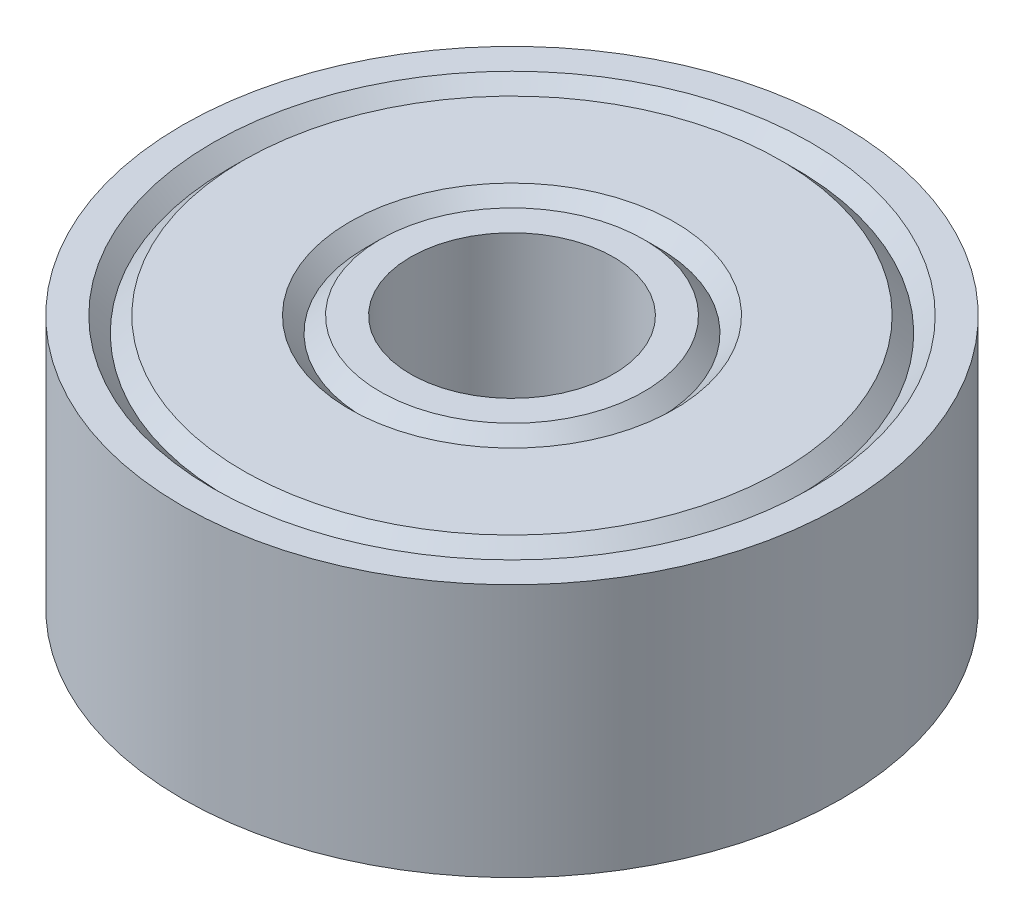
ISO-10303-21;
HEADER;
FILE_DESCRIPTION(('STEP AP214'),'2;1');
FILE_NAME('part.step','',(''),(''),'','','');
FILE_SCHEMA(('AUTOMOTIVE_DESIGN { 1 0 10303 214 1 1 1 1 }'));
ENDSEC;
DATA;
#1=APPLICATION_CONTEXT('core data for automotive mechanical design processes');
#2=APPLICATION_PROTOCOL_DEFINITION('international standard','automotive_design',2000,#1);
#3=PRODUCT_CONTEXT('',#1,'mechanical');
#4=PRODUCT('Part','Part','',(#3));
#5=PRODUCT_RELATED_PRODUCT_CATEGORY('part','',(#4));
#6=PRODUCT_DEFINITION_FORMATION('','',#4);
#7=PRODUCT_DEFINITION_CONTEXT('part definition',#1,'design');
#8=PRODUCT_DEFINITION('design','',#6,#7);
#9=PRODUCT_DEFINITION_SHAPE('','',#8);
#10=(LENGTH_UNIT() NAMED_UNIT(*) SI_UNIT(.MILLI.,.METRE.));
#11=(NAMED_UNIT(*) PLANE_ANGLE_UNIT() SI_UNIT($,.RADIAN.));
#12=(NAMED_UNIT(*) SI_UNIT($,.STERADIAN.) SOLID_ANGLE_UNIT());
#13=UNCERTAINTY_MEASURE_WITH_UNIT(LENGTH_MEASURE(1.E-05),#10,'distance_accuracy_value','');
#14=(GEOMETRIC_REPRESENTATION_CONTEXT(3) GLOBAL_UNCERTAINTY_ASSIGNED_CONTEXT((#13)) GLOBAL_UNIT_ASSIGNED_CONTEXT((#10,
#11,#12)) REPRESENTATION_CONTEXT('',''));
#15=CARTESIAN_POINT('',(0.,0.,0.));
#16=DIRECTION('',(0.,0.,1.));
#17=DIRECTION('',(1.,0.,0.));
#18=AXIS2_PLACEMENT_3D('',#15,#16,#17);
#19=CARTESIAN_POINT('',(0.,2.5,0.));
#20=DIRECTION('',(0.,1.,0.));
#21=DIRECTION('',(-1.,0.,0.));
#22=AXIS2_PLACEMENT_3D('',#19,#20,#21);
#23=CYLINDRICAL_SURFACE('',#22,2.);
#24=CARTESIAN_POINT('',(0.,2.5,0.));
#25=DIRECTION('',(0.,1.,0.));
#26=DIRECTION('',(-1.,0.,0.));
#27=AXIS2_PLACEMENT_3D('',#24,#25,#26);
#28=CIRCLE('',#27,2.);
#29=CARTESIAN_POINT('',(-2.,2.5,0.));
#30=VERTEX_POINT('',#29);
#31=EDGE_CURVE('E83',#30,#30,#28,.T.);
#32=ORIENTED_EDGE('',*,*,#31,.T.);
#33=EDGE_LOOP('',(#32));
#34=FACE_BOUND('',#33,.T.);
#35=CARTESIAN_POINT('',(0.,-2.5,0.));
#36=DIRECTION('',(0.,1.,0.));
#37=DIRECTION('',(-1.,0.,0.));
#38=AXIS2_PLACEMENT_3D('',#35,#36,#37);
#39=CIRCLE('',#38,2.);
#40=CARTESIAN_POINT('',(-2.,-2.5,0.));
#41=VERTEX_POINT('',#40);
#42=EDGE_CURVE('E10',#41,#41,#39,.T.);
#43=ORIENTED_EDGE('',*,*,#42,.F.);
#44=EDGE_LOOP('',(#43));
#45=FACE_BOUND('',#44,.T.);
#46=ADVANCED_FACE('F31',(#34,#45),#23,.F.);
#47=CARTESIAN_POINT('',(-2.,-2.5,0.));
#48=DIRECTION('',(0.,-1.,0.));
#49=DIRECTION('',(1.,0.,0.));
#50=AXIS2_PLACEMENT_3D('',#47,#48,#49);
#51=PLANE('',#50);
#52=ORIENTED_EDGE('',*,*,#42,.T.);
#53=EDGE_LOOP('',(#52));
#54=FACE_BOUND('',#53,.T.);
#55=CARTESIAN_POINT('',(0.,-2.5,0.));
#56=DIRECTION('',(0.,1.,0.));
#57=DIRECTION('',(-1.,0.,0.));
#58=AXIS2_PLACEMENT_3D('',#55,#56,#57);
#59=CIRCLE('',#58,2.6);
#60=CARTESIAN_POINT('',(-2.6,-2.5,0.));
#61=VERTEX_POINT('',#60);
#62=EDGE_CURVE('E37',#61,#61,#59,.T.);
#63=ORIENTED_EDGE('',*,*,#62,.F.);
#64=EDGE_LOOP('',(#63));
#65=FACE_BOUND('',#64,.T.);
#66=ADVANCED_FACE('F101',(#54,#65),#51,.T.);
#67=CARTESIAN_POINT('',(0.,-2.2,0.));
#68=DIRECTION('',(0.,1.,0.));
#69=DIRECTION('',(-1.,0.,0.));
#70=AXIS2_PLACEMENT_3D('',#67,#68,#69);
#71=CONICAL_SURFACE('',#70,2.9,0.78539816339745);
#72=ORIENTED_EDGE('',*,*,#62,.T.);
#73=EDGE_LOOP('',(#72));
#74=FACE_BOUND('',#73,.T.);
#75=CARTESIAN_POINT('',(0.,-2.2,0.));
#76=DIRECTION('',(0.,1.,0.));
#77=DIRECTION('',(-1.,0.,0.));
#78=AXIS2_PLACEMENT_3D('',#75,#76,#77);
#79=CIRCLE('',#78,2.9);
#80=CARTESIAN_POINT('',(-2.9,-2.2,0.));
#81=VERTEX_POINT('',#80);
#82=EDGE_CURVE('E41',#81,#81,#79,.T.);
#83=ORIENTED_EDGE('',*,*,#82,.F.);
#84=EDGE_LOOP('',(#83));
#85=FACE_BOUND('',#84,.T.);
#86=ADVANCED_FACE('F105',(#74,#85),#71,.T.);
#87=CARTESIAN_POINT('',(0.,-2.5,0.));
#88=DIRECTION('',(0.,-1.,0.));
#89=DIRECTION('',(1.,0.,0.));
#90=AXIS2_PLACEMENT_3D('',#87,#88,#89);
#91=CONICAL_SURFACE('',#90,3.2,0.785398163397448);
#92=ORIENTED_EDGE('',*,*,#82,.T.);
#93=EDGE_LOOP('',(#92));
#94=FACE_BOUND('',#93,.T.);
#95=CARTESIAN_POINT('',(0.,-2.5,0.));
#96=DIRECTION('',(0.,1.,0.));
#97=DIRECTION('',(-1.,0.,0.));
#98=AXIS2_PLACEMENT_3D('',#95,#96,#97);
#99=CIRCLE('',#98,3.2);
#100=CARTESIAN_POINT('',(-3.2,-2.5,0.));
#101=VERTEX_POINT('',#100);
#102=EDGE_CURVE('E45',#101,#101,#99,.T.);
#103=ORIENTED_EDGE('',*,*,#102,.F.);
#104=EDGE_LOOP('',(#103));
#105=FACE_BOUND('',#104,.T.);
#106=ADVANCED_FACE('F109',(#94,#105),#91,.F.);
#107=CARTESIAN_POINT('',(-3.2,-2.5,0.));
#108=DIRECTION('',(0.,-1.,0.));
#109=DIRECTION('',(1.,0.,0.));
#110=AXIS2_PLACEMENT_3D('',#107,#108,#109);
#111=PLANE('',#110);
#112=ORIENTED_EDGE('',*,*,#102,.T.);
#113=EDGE_LOOP('',(#112));
#114=FACE_BOUND('',#113,.T.);
#115=CARTESIAN_POINT('',(0.,-2.5,0.));
#116=DIRECTION('',(0.,1.,0.));
#117=DIRECTION('',(-1.,0.,0.));
#118=AXIS2_PLACEMENT_3D('',#115,#116,#117);
#119=CIRCLE('',#118,5.3);
#120=CARTESIAN_POINT('',(-5.3,-2.5,0.));
#121=VERTEX_POINT('',#120);
#122=EDGE_CURVE('E50',#121,#121,#119,.T.);
#123=ORIENTED_EDGE('',*,*,#122,.F.);
#124=EDGE_LOOP('',(#123));
#125=FACE_BOUND('',#124,.T.);
#126=ADVANCED_FACE('F115',(#114,#125),#111,.T.);
#127=CARTESIAN_POINT('',(0.,-2.2,0.));
#128=DIRECTION('',(0.,1.,0.));
#129=DIRECTION('',(-1.,0.,0.));
#130=AXIS2_PLACEMENT_3D('',#127,#128,#129);
#131=CONICAL_SURFACE('',#130,5.6,0.785398163397447);
#132=ORIENTED_EDGE('',*,*,#122,.T.);
#133=EDGE_LOOP('',(#132));
#134=FACE_BOUND('',#133,.T.);
#135=CARTESIAN_POINT('',(0.,-2.2,0.));
#136=DIRECTION('',(0.,1.,0.));
#137=DIRECTION('',(-1.,0.,0.));
#138=AXIS2_PLACEMENT_3D('',#135,#136,#137);
#139=CIRCLE('',#138,5.6);
#140=CARTESIAN_POINT('',(-5.6,-2.2,0.));
#141=VERTEX_POINT('',#140);
#142=EDGE_CURVE('E53',#141,#141,#139,.T.);
#143=ORIENTED_EDGE('',*,*,#142,.F.);
#144=EDGE_LOOP('',(#143));
#145=FACE_BOUND('',#144,.T.);
#146=ADVANCED_FACE('F119',(#134,#145),#131,.T.);
#147=CARTESIAN_POINT('',(0.,-2.5,0.));
#148=DIRECTION('',(0.,-1.,0.));
#149=DIRECTION('',(1.,0.,0.));
#150=AXIS2_PLACEMENT_3D('',#147,#148,#149);
#151=CONICAL_SURFACE('',#150,5.9,0.785398163397444);
#152=ORIENTED_EDGE('',*,*,#142,.T.);
#153=EDGE_LOOP('',(#152));
#154=FACE_BOUND('',#153,.T.);
#155=CARTESIAN_POINT('',(0.,-2.5,0.));
#156=DIRECTION('',(0.,1.,0.));
#157=DIRECTION('',(-1.,0.,0.));
#158=AXIS2_PLACEMENT_3D('',#155,#156,#157);
#159=CIRCLE('',#158,5.9);
#160=CARTESIAN_POINT('',(-5.9,-2.5,0.));
#161=VERTEX_POINT('',#160);
#162=EDGE_CURVE('E56',#161,#161,#159,.T.);
#163=ORIENTED_EDGE('',*,*,#162,.F.);
#164=EDGE_LOOP('',(#163));
#165=FACE_BOUND('',#164,.T.);
#166=ADVANCED_FACE('F123',(#154,#165),#151,.F.);
#167=CARTESIAN_POINT('',(-5.9,-2.5,0.));
#168=DIRECTION('',(0.,-1.,0.));
#169=DIRECTION('',(1.,0.,0.));
#170=AXIS2_PLACEMENT_3D('',#167,#168,#169);
#171=PLANE('',#170);
#172=ORIENTED_EDGE('',*,*,#162,.T.);
#173=EDGE_LOOP('',(#172));
#174=FACE_BOUND('',#173,.T.);
#175=CARTESIAN_POINT('',(0.,-2.5,0.));
#176=DIRECTION('',(0.,1.,0.));
#177=DIRECTION('',(-1.,0.,0.));
#178=AXIS2_PLACEMENT_3D('',#175,#176,#177);
#179=CIRCLE('',#178,6.5);
#180=CARTESIAN_POINT('',(-6.5,-2.5,0.));
#181=VERTEX_POINT('',#180);
#182=EDGE_CURVE('E59',#181,#181,#179,.T.);
#183=ORIENTED_EDGE('',*,*,#182,.F.);
#184=EDGE_LOOP('',(#183));
#185=FACE_BOUND('',#184,.T.);
#186=ADVANCED_FACE('F127',(#174,#185),#171,.T.);
#187=CARTESIAN_POINT('',(0.,2.5,0.));
#188=DIRECTION('',(0.,1.,0.));
#189=DIRECTION('',(-1.,0.,0.));
#190=AXIS2_PLACEMENT_3D('',#187,#188,#189);
#191=CYLINDRICAL_SURFACE('',#190,6.5);
#192=ORIENTED_EDGE('',*,*,#182,.T.);
#193=EDGE_LOOP('',(#192));
#194=FACE_BOUND('',#193,.T.);
#195=CARTESIAN_POINT('',(0.,2.5,0.));
#196=DIRECTION('',(0.,1.,0.));
#197=DIRECTION('',(-1.,0.,0.));
#198=AXIS2_PLACEMENT_3D('',#195,#196,#197);
#199=CIRCLE('',#198,6.5);
#200=CARTESIAN_POINT('',(-6.5,2.5,0.));
#201=VERTEX_POINT('',#200);
#202=EDGE_CURVE('E62',#201,#201,#199,.T.);
#203=ORIENTED_EDGE('',*,*,#202,.F.);
#204=EDGE_LOOP('',(#203));
#205=FACE_BOUND('',#204,.T.);
#206=ADVANCED_FACE('F131',(#194,#205),#191,.T.);
#207=CARTESIAN_POINT('',(-5.9,2.5,0.));
#208=DIRECTION('',(0.,1.,0.));
#209=DIRECTION('',(-1.,0.,0.));
#210=AXIS2_PLACEMENT_3D('',#207,#208,#209);
#211=PLANE('',#210);
#212=ORIENTED_EDGE('',*,*,#202,.T.);
#213=EDGE_LOOP('',(#212));
#214=FACE_BOUND('',#213,.T.);
#215=CARTESIAN_POINT('',(0.,2.5,0.));
#216=DIRECTION('',(0.,1.,0.));
#217=DIRECTION('',(-1.,0.,0.));
#218=AXIS2_PLACEMENT_3D('',#215,#216,#217);
#219=CIRCLE('',#218,5.9);
#220=CARTESIAN_POINT('',(-5.9,2.5,0.));
#221=VERTEX_POINT('',#220);
#222=EDGE_CURVE('E65',#221,#221,#219,.T.);
#223=ORIENTED_EDGE('',*,*,#222,.F.);
#224=EDGE_LOOP('',(#223));
#225=FACE_BOUND('',#224,.T.);
#226=ADVANCED_FACE('F135',(#214,#225),#211,.T.);
#227=CARTESIAN_POINT('',(0.,2.2,0.));
#228=DIRECTION('',(0.,1.,0.));
#229=DIRECTION('',(-1.,0.,0.));
#230=AXIS2_PLACEMENT_3D('',#227,#228,#229);
#231=CONICAL_SURFACE('',#230,5.6,0.785398163397448);
#232=ORIENTED_EDGE('',*,*,#222,.T.);
#233=EDGE_LOOP('',(#232));
#234=FACE_BOUND('',#233,.T.);
#235=CARTESIAN_POINT('',(0.,2.2,0.));
#236=DIRECTION('',(0.,1.,0.));
#237=DIRECTION('',(-1.,0.,0.));
#238=AXIS2_PLACEMENT_3D('',#235,#236,#237);
#239=CIRCLE('',#238,5.6);
#240=CARTESIAN_POINT('',(-5.6,2.2,0.));
#241=VERTEX_POINT('',#240);
#242=EDGE_CURVE('E68',#241,#241,#239,.T.);
#243=ORIENTED_EDGE('',*,*,#242,.F.);
#244=EDGE_LOOP('',(#243));
#245=FACE_BOUND('',#244,.T.);
#246=ADVANCED_FACE('F139',(#234,#245),#231,.F.);
#247=CARTESIAN_POINT('',(0.,2.5,0.));
#248=DIRECTION('',(0.,-1.,0.));
#249=DIRECTION('',(1.,0.,0.));
#250=AXIS2_PLACEMENT_3D('',#247,#248,#249);
#251=CONICAL_SURFACE('',#250,5.3,0.785398163397445);
#252=ORIENTED_EDGE('',*,*,#242,.T.);
#253=EDGE_LOOP('',(#252));
#254=FACE_BOUND('',#253,.T.);
#255=CARTESIAN_POINT('',(0.,2.5,0.));
#256=DIRECTION('',(0.,1.,0.));
#257=DIRECTION('',(-1.,0.,0.));
#258=AXIS2_PLACEMENT_3D('',#255,#256,#257);
#259=CIRCLE('',#258,5.3);
#260=CARTESIAN_POINT('',(-5.3,2.5,0.));
#261=VERTEX_POINT('',#260);
#262=EDGE_CURVE('E71',#261,#261,#259,.T.);
#263=ORIENTED_EDGE('',*,*,#262,.F.);
#264=EDGE_LOOP('',(#263));
#265=FACE_BOUND('',#264,.T.);
#266=ADVANCED_FACE('F143',(#254,#265),#251,.T.);
#267=CARTESIAN_POINT('',(-3.2,2.5,0.));
#268=DIRECTION('',(0.,1.,0.));
#269=DIRECTION('',(-1.,0.,0.));
#270=AXIS2_PLACEMENT_3D('',#267,#268,#269);
#271=PLANE('',#270);
#272=ORIENTED_EDGE('',*,*,#262,.T.);
#273=EDGE_LOOP('',(#272));
#274=FACE_BOUND('',#273,.T.);
#275=CARTESIAN_POINT('',(0.,2.5,0.));
#276=DIRECTION('',(0.,1.,0.));
#277=DIRECTION('',(-1.,0.,0.));
#278=AXIS2_PLACEMENT_3D('',#275,#276,#277);
#279=CIRCLE('',#278,3.2);
#280=CARTESIAN_POINT('',(-3.2,2.5,0.));
#281=VERTEX_POINT('',#280);
#282=EDGE_CURVE('E74',#281,#281,#279,.T.);
#283=ORIENTED_EDGE('',*,*,#282,.F.);
#284=EDGE_LOOP('',(#283));
#285=FACE_BOUND('',#284,.T.);
#286=ADVANCED_FACE('F147',(#274,#285),#271,.T.);
#287=CARTESIAN_POINT('',(0.,2.2,0.));
#288=DIRECTION('',(0.,1.,0.));
#289=DIRECTION('',(-1.,0.,0.));
#290=AXIS2_PLACEMENT_3D('',#287,#288,#289);
#291=CONICAL_SURFACE('',#290,2.9,0.785398163397448);
#292=ORIENTED_EDGE('',*,*,#282,.T.);
#293=EDGE_LOOP('',(#292));
#294=FACE_BOUND('',#293,.T.);
#295=CARTESIAN_POINT('',(0.,2.2,0.));
#296=DIRECTION('',(0.,1.,0.));
#297=DIRECTION('',(-1.,0.,0.));
#298=AXIS2_PLACEMENT_3D('',#295,#296,#297);
#299=CIRCLE('',#298,2.9);
#300=CARTESIAN_POINT('',(-2.9,2.2,0.));
#301=VERTEX_POINT('',#300);
#302=EDGE_CURVE('E77',#301,#301,#299,.T.);
#303=ORIENTED_EDGE('',*,*,#302,.F.);
#304=EDGE_LOOP('',(#303));
#305=FACE_BOUND('',#304,.T.);
#306=ADVANCED_FACE('F97',(#294,#305),#291,.F.);
#307=CARTESIAN_POINT('',(0.,2.5,0.));
#308=DIRECTION('',(0.,-1.,0.));
#309=DIRECTION('',(1.,0.,0.));
#310=AXIS2_PLACEMENT_3D('',#307,#308,#309);
#311=CONICAL_SURFACE('',#310,2.6,0.785398163397448);
#312=ORIENTED_EDGE('',*,*,#302,.T.);
#313=EDGE_LOOP('',(#312));
#314=FACE_BOUND('',#313,.T.);
#315=CARTESIAN_POINT('',(0.,2.5,0.));
#316=DIRECTION('',(0.,1.,0.));
#317=DIRECTION('',(-1.,0.,0.));
#318=AXIS2_PLACEMENT_3D('',#315,#316,#317);
#319=CIRCLE('',#318,2.6);
#320=CARTESIAN_POINT('',(-2.6,2.5,0.));
#321=VERTEX_POINT('',#320);
#322=EDGE_CURVE('E80',#321,#321,#319,.T.);
#323=ORIENTED_EDGE('',*,*,#322,.F.);
#324=EDGE_LOOP('',(#323));
#325=FACE_BOUND('',#324,.T.);
#326=ADVANCED_FACE('F91',(#314,#325),#311,.T.);
#327=CARTESIAN_POINT('',(-2.,2.5,0.));
#328=DIRECTION('',(0.,1.,0.));
#329=DIRECTION('',(-1.,0.,0.));
#330=AXIS2_PLACEMENT_3D('',#327,#328,#329);
#331=PLANE('',#330);
#332=ORIENTED_EDGE('',*,*,#322,.T.);
#333=EDGE_LOOP('',(#332));
#334=FACE_BOUND('',#333,.T.);
#335=ORIENTED_EDGE('',*,*,#31,.F.);
#336=EDGE_LOOP('',(#335));
#337=FACE_BOUND('',#336,.T.);
#338=ADVANCED_FACE('F89',(#334,#337),#331,.T.);
#339=CLOSED_SHELL('',(#46,#66,#86,#106,#126,#146,#166,#186,#206,#226,#246,#266,#286,#306,#326,#338));
#340=MANIFOLD_SOLID_BREP('B2',#339);
#341=ADVANCED_BREP_SHAPE_REPRESENTATION('',(#18,#340),#14);
#342=SHAPE_DEFINITION_REPRESENTATION(#9,#341);
ENDSEC;
END-ISO-10303-21;
